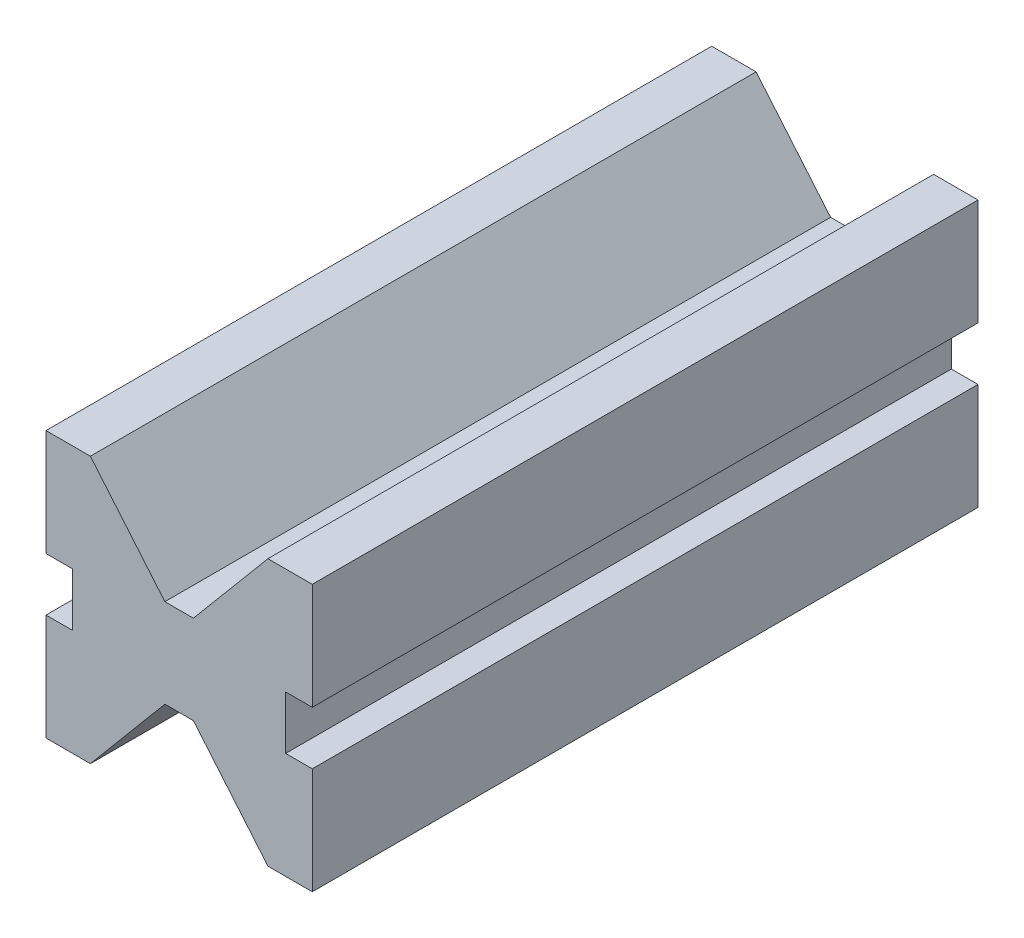
ISO-10303-21;
HEADER;
FILE_DESCRIPTION(('STEP AP214'),'2;1');
FILE_NAME('part.step','',(''),(''),'','','');
FILE_SCHEMA(('AUTOMOTIVE_DESIGN { 1 0 10303 214 1 1 1 1 }'));
ENDSEC;
DATA;
#1=APPLICATION_CONTEXT('core data for automotive mechanical design processes');
#2=APPLICATION_PROTOCOL_DEFINITION('international standard','automotive_design',2000,#1);
#3=PRODUCT_CONTEXT('',#1,'mechanical');
#4=PRODUCT('Part','Part','',(#3));
#5=PRODUCT_RELATED_PRODUCT_CATEGORY('part','',(#4));
#6=PRODUCT_DEFINITION_FORMATION('','',#4);
#7=PRODUCT_DEFINITION_CONTEXT('part definition',#1,'design');
#8=PRODUCT_DEFINITION('design','',#6,#7);
#9=PRODUCT_DEFINITION_SHAPE('','',#8);
#10=(LENGTH_UNIT() NAMED_UNIT(*) SI_UNIT(.MILLI.,.METRE.));
#11=(NAMED_UNIT(*) PLANE_ANGLE_UNIT() SI_UNIT($,.RADIAN.));
#12=(NAMED_UNIT(*) SI_UNIT($,.STERADIAN.) SOLID_ANGLE_UNIT());
#13=UNCERTAINTY_MEASURE_WITH_UNIT(LENGTH_MEASURE(1.E-05),#10,'distance_accuracy_value','');
#14=(GEOMETRIC_REPRESENTATION_CONTEXT(3) GLOBAL_UNCERTAINTY_ASSIGNED_CONTEXT((#13)) GLOBAL_UNIT_ASSIGNED_CONTEXT((#10,
#11,#12)) REPRESENTATION_CONTEXT('',''));
#15=CARTESIAN_POINT('',(0.,0.,0.));
#16=DIRECTION('',(0.,0.,1.));
#17=DIRECTION('',(1.,0.,0.));
#18=AXIS2_PLACEMENT_3D('',#15,#16,#17);
#19=CARTESIAN_POINT('',(10.,0.,150.));
#20=DIRECTION('',(0.,1.,0.));
#21=DIRECTION('',(0.,0.,1.));
#22=AXIS2_PLACEMENT_3D('',#19,#20,#21);
#23=PLANE('',#22);
#24=DIRECTION('',(1.,0.,0.));
#25=VECTOR('',#24,1.);
#26=CARTESIAN_POINT('',(10.,0.,0.));
#27=LINE('',#26,#25);
#28=CARTESIAN_POINT('',(0.,0.,0.));
#29=VERTEX_POINT('',#28);
#30=CARTESIAN_POINT('',(10.,0.,0.));
#31=VERTEX_POINT('',#30);
#32=EDGE_CURVE('E212',#29,#31,#27,.T.);
#33=ORIENTED_EDGE('',*,*,#32,.T.);
#34=DIRECTION('',(0.,0.,-1.));
#35=VECTOR('',#34,1.);
#36=CARTESIAN_POINT('',(10.,0.,150.));
#37=LINE('',#36,#35);
#38=CARTESIAN_POINT('',(10.,0.,150.));
#39=VERTEX_POINT('',#38);
#40=EDGE_CURVE('E11',#39,#31,#37,.T.);
#41=ORIENTED_EDGE('',*,*,#40,.F.);
#42=DIRECTION('',(1.,0.,0.));
#43=VECTOR('',#42,1.);
#44=CARTESIAN_POINT('',(10.,0.,150.));
#45=LINE('',#44,#43);
#46=CARTESIAN_POINT('',(0.,0.,150.));
#47=VERTEX_POINT('',#46);
#48=EDGE_CURVE('E270',#47,#39,#45,.T.);
#49=ORIENTED_EDGE('',*,*,#48,.F.);
#50=DIRECTION('',(0.,0.,-1.));
#51=VECTOR('',#50,1.);
#52=CARTESIAN_POINT('',(0.,0.,150.));
#53=LINE('',#52,#51);
#54=EDGE_CURVE('E208',#47,#29,#53,.T.);
#55=ORIENTED_EDGE('',*,*,#54,.T.);
#56=EDGE_LOOP('',(#33,#41,#49,#55));
#57=FACE_BOUND('',#56,.T.);
#58=ADVANCED_FACE('F39',(#57),#23,.F.);
#59=CARTESIAN_POINT('',(26.7819926235455,20.,150.));
#60=DIRECTION('',(-0.766044443118979,0.642787609686538,0.));
#61=DIRECTION('',(-0.642787609686538,-0.766044443118979,0.));
#62=AXIS2_PLACEMENT_3D('',#59,#60,#61);
#63=PLANE('',#62);
#64=DIRECTION('',(0.642787609686538,0.766044443118979,0.));
#65=VECTOR('',#64,1.);
#66=CARTESIAN_POINT('',(26.7819926235455,20.,0.));
#67=LINE('',#66,#65);
#68=CARTESIAN_POINT('',(26.7819926235455,20.,0.));
#69=VERTEX_POINT('',#68);
#70=EDGE_CURVE('E216',#31,#69,#67,.T.);
#71=ORIENTED_EDGE('',*,*,#70,.T.);
#72=DIRECTION('',(0.,0.,-1.));
#73=VECTOR('',#72,1.);
#74=CARTESIAN_POINT('',(26.7819926235455,20.,150.));
#75=LINE('',#74,#73);
#76=CARTESIAN_POINT('',(26.7819926235455,20.,150.));
#77=VERTEX_POINT('',#76);
#78=EDGE_CURVE('E48',#77,#69,#75,.T.);
#79=ORIENTED_EDGE('',*,*,#78,.F.);
#80=DIRECTION('',(0.642787609686538,0.766044443118979,0.));
#81=VECTOR('',#80,1.);
#82=CARTESIAN_POINT('',(26.7819926235455,20.,150.));
#83=LINE('',#82,#81);
#84=EDGE_CURVE('E135',#39,#77,#83,.T.);
#85=ORIENTED_EDGE('',*,*,#84,.F.);
#86=ORIENTED_EDGE('',*,*,#40,.T.);
#87=EDGE_LOOP('',(#71,#79,#85,#86));
#88=FACE_BOUND('',#87,.T.);
#89=ADVANCED_FACE('F420',(#88),#63,.F.);
#90=CARTESIAN_POINT('',(33.2180073764545,20.,150.));
#91=DIRECTION('',(0.,1.,0.));
#92=DIRECTION('',(0.,0.,1.));
#93=AXIS2_PLACEMENT_3D('',#90,#91,#92);
#94=PLANE('',#93);
#95=DIRECTION('',(1.,0.,0.));
#96=VECTOR('',#95,1.);
#97=CARTESIAN_POINT('',(33.2180073764545,20.,0.));
#98=LINE('',#97,#96);
#99=CARTESIAN_POINT('',(33.2180073764545,20.,0.));
#100=VERTEX_POINT('',#99);
#101=EDGE_CURVE('E219',#69,#100,#98,.T.);
#102=ORIENTED_EDGE('',*,*,#101,.T.);
#103=DIRECTION('',(0.,0.,-1.));
#104=VECTOR('',#103,1.);
#105=CARTESIAN_POINT('',(33.2180073764545,20.,150.));
#106=LINE('',#105,#104);
#107=CARTESIAN_POINT('',(33.2180073764545,20.,150.));
#108=VERTEX_POINT('',#107);
#109=EDGE_CURVE('E329',#108,#100,#106,.T.);
#110=ORIENTED_EDGE('',*,*,#109,.F.);
#111=DIRECTION('',(1.,0.,0.));
#112=VECTOR('',#111,1.);
#113=CARTESIAN_POINT('',(33.2180073764545,20.,150.));
#114=LINE('',#113,#112);
#115=EDGE_CURVE('E339',#77,#108,#114,.T.);
#116=ORIENTED_EDGE('',*,*,#115,.F.);
#117=ORIENTED_EDGE('',*,*,#78,.T.);
#118=EDGE_LOOP('',(#102,#110,#116,#117));
#119=FACE_BOUND('',#118,.T.);
#120=ADVANCED_FACE('F337',(#119),#94,.F.);
#121=CARTESIAN_POINT('',(50.,0.,150.));
#122=DIRECTION('',(0.766044443118979,0.642787609686538,0.));
#123=DIRECTION('',(-0.642787609686538,0.766044443118979,0.));
#124=AXIS2_PLACEMENT_3D('',#121,#122,#123);
#125=PLANE('',#124);
#126=DIRECTION('',(0.642787609686538,-0.766044443118979,0.));
#127=VECTOR('',#126,1.);
#128=CARTESIAN_POINT('',(50.,0.,0.));
#129=LINE('',#128,#127);
#130=CARTESIAN_POINT('',(50.,0.,0.));
#131=VERTEX_POINT('',#130);
#132=EDGE_CURVE('E222',#100,#131,#129,.T.);
#133=ORIENTED_EDGE('',*,*,#132,.T.);
#134=DIRECTION('',(0.,0.,-1.));
#135=VECTOR('',#134,1.);
#136=CARTESIAN_POINT('',(50.,0.,150.));
#137=LINE('',#136,#135);
#138=CARTESIAN_POINT('',(50.,0.,150.));
#139=VERTEX_POINT('',#138);
#140=EDGE_CURVE('E325',#139,#131,#137,.T.);
#141=ORIENTED_EDGE('',*,*,#140,.F.);
#142=DIRECTION('',(0.642787609686538,-0.766044443118979,0.));
#143=VECTOR('',#142,1.);
#144=CARTESIAN_POINT('',(50.,0.,150.));
#145=LINE('',#144,#143);
#146=EDGE_CURVE('E358',#108,#139,#145,.T.);
#147=ORIENTED_EDGE('',*,*,#146,.F.);
#148=ORIENTED_EDGE('',*,*,#109,.T.);
#149=EDGE_LOOP('',(#133,#141,#147,#148));
#150=FACE_BOUND('',#149,.T.);
#151=ADVANCED_FACE('F348',(#150),#125,.F.);
#152=CARTESIAN_POINT('',(60.,0.,150.));
#153=DIRECTION('',(0.,1.,0.));
#154=DIRECTION('',(0.,0.,1.));
#155=AXIS2_PLACEMENT_3D('',#152,#153,#154);
#156=PLANE('',#155);
#157=DIRECTION('',(1.,0.,0.));
#158=VECTOR('',#157,1.);
#159=CARTESIAN_POINT('',(60.,0.,0.));
#160=LINE('',#159,#158);
#161=CARTESIAN_POINT('',(60.,0.,0.));
#162=VERTEX_POINT('',#161);
#163=EDGE_CURVE('E225',#131,#162,#160,.T.);
#164=ORIENTED_EDGE('',*,*,#163,.T.);
#165=DIRECTION('',(0.,0.,-1.));
#166=VECTOR('',#165,1.);
#167=CARTESIAN_POINT('',(60.,0.,150.));
#168=LINE('',#167,#166);
#169=CARTESIAN_POINT('',(60.,0.,150.));
#170=VERTEX_POINT('',#169);
#171=EDGE_CURVE('E321',#170,#162,#168,.T.);
#172=ORIENTED_EDGE('',*,*,#171,.F.);
#173=DIRECTION('',(1.,0.,0.));
#174=VECTOR('',#173,1.);
#175=CARTESIAN_POINT('',(60.,0.,150.));
#176=LINE('',#175,#174);
#177=EDGE_CURVE('E354',#139,#170,#176,.T.);
#178=ORIENTED_EDGE('',*,*,#177,.F.);
#179=ORIENTED_EDGE('',*,*,#140,.T.);
#180=EDGE_LOOP('',(#164,#172,#178,#179));
#181=FACE_BOUND('',#180,.T.);
#182=ADVANCED_FACE('F352',(#181),#156,.F.);
#183=CARTESIAN_POINT('',(60.,24.,150.));
#184=DIRECTION('',(-1.,0.,0.));
#185=DIRECTION('',(0.,0.,1.));
#186=AXIS2_PLACEMENT_3D('',#183,#184,#185);
#187=PLANE('',#186);
#188=DIRECTION('',(0.,1.,0.));
#189=VECTOR('',#188,1.);
#190=CARTESIAN_POINT('',(60.,24.,0.));
#191=LINE('',#190,#189);
#192=CARTESIAN_POINT('',(60.,24.,0.));
#193=VERTEX_POINT('',#192);
#194=EDGE_CURVE('E228',#162,#193,#191,.T.);
#195=ORIENTED_EDGE('',*,*,#194,.T.);
#196=DIRECTION('',(0.,0.,-1.));
#197=VECTOR('',#196,1.);
#198=CARTESIAN_POINT('',(60.,24.,150.));
#199=LINE('',#198,#197);
#200=CARTESIAN_POINT('',(60.,24.,150.));
#201=VERTEX_POINT('',#200);
#202=EDGE_CURVE('E317',#201,#193,#199,.T.);
#203=ORIENTED_EDGE('',*,*,#202,.F.);
#204=DIRECTION('',(0.,1.,0.));
#205=VECTOR('',#204,1.);
#206=CARTESIAN_POINT('',(60.,24.,150.));
#207=LINE('',#206,#205);
#208=EDGE_CURVE('E357',#170,#201,#207,.T.);
#209=ORIENTED_EDGE('',*,*,#208,.F.);
#210=ORIENTED_EDGE('',*,*,#171,.T.);
#211=EDGE_LOOP('',(#195,#203,#209,#210));
#212=FACE_BOUND('',#211,.T.);
#213=ADVANCED_FACE('F433',(#212),#187,.F.);
#214=CARTESIAN_POINT('',(54.,24.,150.));
#215=DIRECTION('',(0.,-1.,0.));
#216=DIRECTION('',(0.,0.,-1.));
#217=AXIS2_PLACEMENT_3D('',#214,#215,#216);
#218=PLANE('',#217);
#219=DIRECTION('',(-1.,0.,0.));
#220=VECTOR('',#219,1.);
#221=CARTESIAN_POINT('',(54.,24.,0.));
#222=LINE('',#221,#220);
#223=CARTESIAN_POINT('',(54.,24.,0.));
#224=VERTEX_POINT('',#223);
#225=EDGE_CURVE('E231',#193,#224,#222,.T.);
#226=ORIENTED_EDGE('',*,*,#225,.T.);
#227=DIRECTION('',(0.,0.,-1.));
#228=VECTOR('',#227,1.);
#229=CARTESIAN_POINT('',(54.,24.,150.));
#230=LINE('',#229,#228);
#231=CARTESIAN_POINT('',(54.,24.,150.));
#232=VERTEX_POINT('',#231);
#233=EDGE_CURVE('E313',#232,#224,#230,.T.);
#234=ORIENTED_EDGE('',*,*,#233,.F.);
#235=DIRECTION('',(-1.,0.,0.));
#236=VECTOR('',#235,1.);
#237=CARTESIAN_POINT('',(54.,24.,150.));
#238=LINE('',#237,#236);
#239=EDGE_CURVE('E362',#201,#232,#238,.T.);
#240=ORIENTED_EDGE('',*,*,#239,.F.);
#241=ORIENTED_EDGE('',*,*,#202,.T.);
#242=EDGE_LOOP('',(#226,#234,#240,#241));
#243=FACE_BOUND('',#242,.T.);
#244=ADVANCED_FACE('F436',(#243),#218,.F.);
#245=CARTESIAN_POINT('',(54.,36.,150.));
#246=DIRECTION('',(-1.,0.,0.));
#247=DIRECTION('',(0.,-1.,0.));
#248=AXIS2_PLACEMENT_3D('',#245,#246,#247);
#249=PLANE('',#248);
#250=DIRECTION('',(0.,1.,0.));
#251=VECTOR('',#250,1.);
#252=CARTESIAN_POINT('',(54.,36.,0.));
#253=LINE('',#252,#251);
#254=CARTESIAN_POINT('',(54.,36.,0.));
#255=VERTEX_POINT('',#254);
#256=EDGE_CURVE('E234',#224,#255,#253,.T.);
#257=ORIENTED_EDGE('',*,*,#256,.T.);
#258=DIRECTION('',(0.,0.,-1.));
#259=VECTOR('',#258,1.);
#260=CARTESIAN_POINT('',(54.,36.,150.));
#261=LINE('',#260,#259);
#262=CARTESIAN_POINT('',(54.,36.,150.));
#263=VERTEX_POINT('',#262);
#264=EDGE_CURVE('E309',#263,#255,#261,.T.);
#265=ORIENTED_EDGE('',*,*,#264,.F.);
#266=DIRECTION('',(0.,1.,0.));
#267=VECTOR('',#266,1.);
#268=CARTESIAN_POINT('',(54.,36.,150.));
#269=LINE('',#268,#267);
#270=EDGE_CURVE('E369',#232,#263,#269,.T.);
#271=ORIENTED_EDGE('',*,*,#270,.F.);
#272=ORIENTED_EDGE('',*,*,#233,.T.);
#273=EDGE_LOOP('',(#257,#265,#271,#272));
#274=FACE_BOUND('',#273,.T.);
#275=ADVANCED_FACE('F440',(#274),#249,.F.);
#276=CARTESIAN_POINT('',(60.,36.,150.));
#277=DIRECTION('',(0.,1.,0.));
#278=DIRECTION('',(0.,0.,1.));
#279=AXIS2_PLACEMENT_3D('',#276,#277,#278);
#280=PLANE('',#279);
#281=DIRECTION('',(1.,0.,0.));
#282=VECTOR('',#281,1.);
#283=CARTESIAN_POINT('',(60.,36.,0.));
#284=LINE('',#283,#282);
#285=CARTESIAN_POINT('',(60.,36.,0.));
#286=VERTEX_POINT('',#285);
#287=EDGE_CURVE('E237',#255,#286,#284,.T.);
#288=ORIENTED_EDGE('',*,*,#287,.T.);
#289=DIRECTION('',(0.,0.,-1.));
#290=VECTOR('',#289,1.);
#291=CARTESIAN_POINT('',(60.,36.,150.));
#292=LINE('',#291,#290);
#293=CARTESIAN_POINT('',(60.,36.,150.));
#294=VERTEX_POINT('',#293);
#295=EDGE_CURVE('E305',#294,#286,#292,.T.);
#296=ORIENTED_EDGE('',*,*,#295,.F.);
#297=DIRECTION('',(1.,0.,0.));
#298=VECTOR('',#297,1.);
#299=CARTESIAN_POINT('',(60.,36.,150.));
#300=LINE('',#299,#298);
#301=EDGE_CURVE('E372',#263,#294,#300,.T.);
#302=ORIENTED_EDGE('',*,*,#301,.F.);
#303=ORIENTED_EDGE('',*,*,#264,.T.);
#304=EDGE_LOOP('',(#288,#296,#302,#303));
#305=FACE_BOUND('',#304,.T.);
#306=ADVANCED_FACE('F444',(#305),#280,.F.);
#307=CARTESIAN_POINT('',(60.,60.,150.));
#308=DIRECTION('',(-1.,0.,0.));
#309=DIRECTION('',(0.,-1.,0.));
#310=AXIS2_PLACEMENT_3D('',#307,#308,#309);
#311=PLANE('',#310);
#312=DIRECTION('',(0.,1.,0.));
#313=VECTOR('',#312,1.);
#314=CARTESIAN_POINT('',(60.,60.,0.));
#315=LINE('',#314,#313);
#316=CARTESIAN_POINT('',(60.,60.,0.));
#317=VERTEX_POINT('',#316);
#318=EDGE_CURVE('E240',#286,#317,#315,.T.);
#319=ORIENTED_EDGE('',*,*,#318,.T.);
#320=DIRECTION('',(0.,0.,-1.));
#321=VECTOR('',#320,1.);
#322=CARTESIAN_POINT('',(60.,60.,150.));
#323=LINE('',#322,#321);
#324=CARTESIAN_POINT('',(60.,60.,150.));
#325=VERTEX_POINT('',#324);
#326=EDGE_CURVE('E301',#325,#317,#323,.T.);
#327=ORIENTED_EDGE('',*,*,#326,.F.);
#328=DIRECTION('',(0.,1.,0.));
#329=VECTOR('',#328,1.);
#330=CARTESIAN_POINT('',(60.,60.,150.));
#331=LINE('',#330,#329);
#332=EDGE_CURVE('E375',#294,#325,#331,.T.);
#333=ORIENTED_EDGE('',*,*,#332,.F.);
#334=ORIENTED_EDGE('',*,*,#295,.T.);
#335=EDGE_LOOP('',(#319,#327,#333,#334));
#336=FACE_BOUND('',#335,.T.);
#337=ADVANCED_FACE('F448',(#336),#311,.F.);
#338=CARTESIAN_POINT('',(50.,60.,150.));
#339=DIRECTION('',(0.,-1.,0.));
#340=DIRECTION('',(0.,0.,-1.));
#341=AXIS2_PLACEMENT_3D('',#338,#339,#340);
#342=PLANE('',#341);
#343=DIRECTION('',(-1.,0.,0.));
#344=VECTOR('',#343,1.);
#345=CARTESIAN_POINT('',(50.,60.,0.));
#346=LINE('',#345,#344);
#347=CARTESIAN_POINT('',(50.,60.,0.));
#348=VERTEX_POINT('',#347);
#349=EDGE_CURVE('E243',#317,#348,#346,.T.);
#350=ORIENTED_EDGE('',*,*,#349,.T.);
#351=DIRECTION('',(0.,0.,-1.));
#352=VECTOR('',#351,1.);
#353=CARTESIAN_POINT('',(50.,60.,150.));
#354=LINE('',#353,#352);
#355=CARTESIAN_POINT('',(50.,60.,150.));
#356=VERTEX_POINT('',#355);
#357=EDGE_CURVE('E297',#356,#348,#354,.T.);
#358=ORIENTED_EDGE('',*,*,#357,.F.);
#359=DIRECTION('',(-1.,0.,0.));
#360=VECTOR('',#359,1.);
#361=CARTESIAN_POINT('',(50.,60.,150.));
#362=LINE('',#361,#360);
#363=EDGE_CURVE('E378',#325,#356,#362,.T.);
#364=ORIENTED_EDGE('',*,*,#363,.F.);
#365=ORIENTED_EDGE('',*,*,#326,.T.);
#366=EDGE_LOOP('',(#350,#358,#364,#365));
#367=FACE_BOUND('',#366,.T.);
#368=ADVANCED_FACE('F452',(#367),#342,.F.);
#369=CARTESIAN_POINT('',(33.2180073764545,40.,150.));
#370=DIRECTION('',(0.766044443118979,-0.642787609686538,0.));
#371=DIRECTION('',(0.642787609686538,0.766044443118979,0.));
#372=AXIS2_PLACEMENT_3D('',#369,#370,#371);
#373=PLANE('',#372);
#374=DIRECTION('',(-0.642787609686538,-0.766044443118979,0.));
#375=VECTOR('',#374,1.);
#376=CARTESIAN_POINT('',(33.2180073764545,40.,0.));
#377=LINE('',#376,#375);
#378=CARTESIAN_POINT('',(33.2180073764545,40.,0.));
#379=VERTEX_POINT('',#378);
#380=EDGE_CURVE('E246',#348,#379,#377,.T.);
#381=ORIENTED_EDGE('',*,*,#380,.T.);
#382=DIRECTION('',(0.,0.,-1.));
#383=VECTOR('',#382,1.);
#384=CARTESIAN_POINT('',(33.2180073764545,40.,150.));
#385=LINE('',#384,#383);
#386=CARTESIAN_POINT('',(33.2180073764545,40.,150.));
#387=VERTEX_POINT('',#386);
#388=EDGE_CURVE('E293',#387,#379,#385,.T.);
#389=ORIENTED_EDGE('',*,*,#388,.F.);
#390=DIRECTION('',(-0.642787609686538,-0.766044443118979,0.));
#391=VECTOR('',#390,1.);
#392=CARTESIAN_POINT('',(33.2180073764545,40.,150.));
#393=LINE('',#392,#391);
#394=EDGE_CURVE('E381',#356,#387,#393,.T.);
#395=ORIENTED_EDGE('',*,*,#394,.F.);
#396=ORIENTED_EDGE('',*,*,#357,.T.);
#397=EDGE_LOOP('',(#381,#389,#395,#396));
#398=FACE_BOUND('',#397,.T.);
#399=ADVANCED_FACE('F456',(#398),#373,.F.);
#400=CARTESIAN_POINT('',(26.7819926235455,40.,150.));
#401=DIRECTION('',(0.,-1.,0.));
#402=DIRECTION('',(0.,0.,-1.));
#403=AXIS2_PLACEMENT_3D('',#400,#401,#402);
#404=PLANE('',#403);
#405=DIRECTION('',(-1.,0.,0.));
#406=VECTOR('',#405,1.);
#407=CARTESIAN_POINT('',(26.7819926235455,40.,0.));
#408=LINE('',#407,#406);
#409=CARTESIAN_POINT('',(26.7819926235455,40.,0.));
#410=VERTEX_POINT('',#409);
#411=EDGE_CURVE('E249',#379,#410,#408,.T.);
#412=ORIENTED_EDGE('',*,*,#411,.T.);
#413=DIRECTION('',(0.,0.,-1.));
#414=VECTOR('',#413,1.);
#415=CARTESIAN_POINT('',(26.7819926235455,40.,150.));
#416=LINE('',#415,#414);
#417=CARTESIAN_POINT('',(26.7819926235455,40.,150.));
#418=VERTEX_POINT('',#417);
#419=EDGE_CURVE('E289',#418,#410,#416,.T.);
#420=ORIENTED_EDGE('',*,*,#419,.F.);
#421=DIRECTION('',(-1.,0.,0.));
#422=VECTOR('',#421,1.);
#423=CARTESIAN_POINT('',(26.7819926235455,40.,150.));
#424=LINE('',#423,#422);
#425=EDGE_CURVE('E384',#387,#418,#424,.T.);
#426=ORIENTED_EDGE('',*,*,#425,.F.);
#427=ORIENTED_EDGE('',*,*,#388,.T.);
#428=EDGE_LOOP('',(#412,#420,#426,#427));
#429=FACE_BOUND('',#428,.T.);
#430=ADVANCED_FACE('F460',(#429),#404,.F.);
#431=CARTESIAN_POINT('',(10.,60.,150.));
#432=DIRECTION('',(-0.766044443118979,-0.642787609686538,0.));
#433=DIRECTION('',(0.642787609686538,-0.766044443118979,0.));
#434=AXIS2_PLACEMENT_3D('',#431,#432,#433);
#435=PLANE('',#434);
#436=DIRECTION('',(-0.642787609686538,0.766044443118979,0.));
#437=VECTOR('',#436,1.);
#438=CARTESIAN_POINT('',(10.,60.,0.));
#439=LINE('',#438,#437);
#440=CARTESIAN_POINT('',(10.,60.,0.));
#441=VERTEX_POINT('',#440);
#442=EDGE_CURVE('E252',#410,#441,#439,.T.);
#443=ORIENTED_EDGE('',*,*,#442,.T.);
#444=DIRECTION('',(0.,0.,-1.));
#445=VECTOR('',#444,1.);
#446=CARTESIAN_POINT('',(10.,60.,150.));
#447=LINE('',#446,#445);
#448=CARTESIAN_POINT('',(10.,60.,150.));
#449=VERTEX_POINT('',#448);
#450=EDGE_CURVE('E285',#449,#441,#447,.T.);
#451=ORIENTED_EDGE('',*,*,#450,.F.);
#452=DIRECTION('',(-0.642787609686538,0.766044443118979,0.));
#453=VECTOR('',#452,1.);
#454=CARTESIAN_POINT('',(10.,60.,150.));
#455=LINE('',#454,#453);
#456=EDGE_CURVE('E387',#418,#449,#455,.T.);
#457=ORIENTED_EDGE('',*,*,#456,.F.);
#458=ORIENTED_EDGE('',*,*,#419,.T.);
#459=EDGE_LOOP('',(#443,#451,#457,#458));
#460=FACE_BOUND('',#459,.T.);
#461=ADVANCED_FACE('F464',(#460),#435,.F.);
#462=CARTESIAN_POINT('',(0.,60.,150.));
#463=DIRECTION('',(0.,-1.,0.));
#464=DIRECTION('',(0.,0.,-1.));
#465=AXIS2_PLACEMENT_3D('',#462,#463,#464);
#466=PLANE('',#465);
#467=DIRECTION('',(-1.,0.,0.));
#468=VECTOR('',#467,1.);
#469=CARTESIAN_POINT('',(0.,60.,0.));
#470=LINE('',#469,#468);
#471=CARTESIAN_POINT('',(0.,60.,0.));
#472=VERTEX_POINT('',#471);
#473=EDGE_CURVE('E255',#441,#472,#470,.T.);
#474=ORIENTED_EDGE('',*,*,#473,.T.);
#475=DIRECTION('',(0.,0.,-1.));
#476=VECTOR('',#475,1.);
#477=CARTESIAN_POINT('',(0.,60.,150.));
#478=LINE('',#477,#476);
#479=CARTESIAN_POINT('',(0.,60.,150.));
#480=VERTEX_POINT('',#479);
#481=EDGE_CURVE('E281',#480,#472,#478,.T.);
#482=ORIENTED_EDGE('',*,*,#481,.F.);
#483=DIRECTION('',(-1.,0.,0.));
#484=VECTOR('',#483,1.);
#485=CARTESIAN_POINT('',(0.,60.,150.));
#486=LINE('',#485,#484);
#487=EDGE_CURVE('E390',#449,#480,#486,.T.);
#488=ORIENTED_EDGE('',*,*,#487,.F.);
#489=ORIENTED_EDGE('',*,*,#450,.T.);
#490=EDGE_LOOP('',(#474,#482,#488,#489));
#491=FACE_BOUND('',#490,.T.);
#492=ADVANCED_FACE('F468',(#491),#466,.F.);
#493=CARTESIAN_POINT('',(0.,36.,150.));
#494=DIRECTION('',(1.,0.,0.));
#495=DIRECTION('',(0.,0.,-1.));
#496=AXIS2_PLACEMENT_3D('',#493,#494,#495);
#497=PLANE('',#496);
#498=DIRECTION('',(0.,-1.,0.));
#499=VECTOR('',#498,1.);
#500=CARTESIAN_POINT('',(0.,36.,0.));
#501=LINE('',#500,#499);
#502=CARTESIAN_POINT('',(0.,36.,0.));
#503=VERTEX_POINT('',#502);
#504=EDGE_CURVE('E258',#472,#503,#501,.T.);
#505=ORIENTED_EDGE('',*,*,#504,.T.);
#506=DIRECTION('',(0.,0.,-1.));
#507=VECTOR('',#506,1.);
#508=CARTESIAN_POINT('',(0.,36.,150.));
#509=LINE('',#508,#507);
#510=CARTESIAN_POINT('',(0.,36.,150.));
#511=VERTEX_POINT('',#510);
#512=EDGE_CURVE('E277',#511,#503,#509,.T.);
#513=ORIENTED_EDGE('',*,*,#512,.F.);
#514=DIRECTION('',(0.,-1.,0.));
#515=VECTOR('',#514,1.);
#516=CARTESIAN_POINT('',(0.,36.,150.));
#517=LINE('',#516,#515);
#518=EDGE_CURVE('E393',#480,#511,#517,.T.);
#519=ORIENTED_EDGE('',*,*,#518,.F.);
#520=ORIENTED_EDGE('',*,*,#481,.T.);
#521=EDGE_LOOP('',(#505,#513,#519,#520));
#522=FACE_BOUND('',#521,.T.);
#523=ADVANCED_FACE('F401',(#522),#497,.F.);
#524=CARTESIAN_POINT('',(6.,36.,150.));
#525=DIRECTION('',(0.,1.,0.));
#526=DIRECTION('',(-1.,0.,0.));
#527=AXIS2_PLACEMENT_3D('',#524,#525,#526);
#528=PLANE('',#527);
#529=DIRECTION('',(1.,0.,0.));
#530=VECTOR('',#529,1.);
#531=CARTESIAN_POINT('',(6.,36.,0.));
#532=LINE('',#531,#530);
#533=CARTESIAN_POINT('',(6.,36.,0.));
#534=VERTEX_POINT('',#533);
#535=EDGE_CURVE('E261',#503,#534,#532,.T.);
#536=ORIENTED_EDGE('',*,*,#535,.T.);
#537=DIRECTION('',(0.,0.,-1.));
#538=VECTOR('',#537,1.);
#539=CARTESIAN_POINT('',(6.,36.,150.));
#540=LINE('',#539,#538);
#541=CARTESIAN_POINT('',(6.,36.,150.));
#542=VERTEX_POINT('',#541);
#543=EDGE_CURVE('E201',#542,#534,#540,.T.);
#544=ORIENTED_EDGE('',*,*,#543,.F.);
#545=DIRECTION('',(1.,0.,0.));
#546=VECTOR('',#545,1.);
#547=CARTESIAN_POINT('',(6.,36.,150.));
#548=LINE('',#547,#546);
#549=EDGE_CURVE('E190',#511,#542,#548,.T.);
#550=ORIENTED_EDGE('',*,*,#549,.F.);
#551=ORIENTED_EDGE('',*,*,#512,.T.);
#552=EDGE_LOOP('',(#536,#544,#550,#551));
#553=FACE_BOUND('',#552,.T.);
#554=ADVANCED_FACE('F405',(#553),#528,.F.);
#555=CARTESIAN_POINT('',(6.,24.,150.));
#556=DIRECTION('',(1.,0.,0.));
#557=DIRECTION('',(0.,1.,0.));
#558=AXIS2_PLACEMENT_3D('',#555,#556,#557);
#559=PLANE('',#558);
#560=DIRECTION('',(0.,-1.,0.));
#561=VECTOR('',#560,1.);
#562=CARTESIAN_POINT('',(6.,24.,0.));
#563=LINE('',#562,#561);
#564=CARTESIAN_POINT('',(6.,24.,0.));
#565=VERTEX_POINT('',#564);
#566=EDGE_CURVE('E199',#534,#565,#563,.T.);
#567=ORIENTED_EDGE('',*,*,#566,.T.);
#568=DIRECTION('',(0.,0.,-1.));
#569=VECTOR('',#568,1.);
#570=CARTESIAN_POINT('',(6.,24.,150.));
#571=LINE('',#570,#569);
#572=CARTESIAN_POINT('',(6.,24.,150.));
#573=VERTEX_POINT('',#572);
#574=EDGE_CURVE('E196',#573,#565,#571,.T.);
#575=ORIENTED_EDGE('',*,*,#574,.F.);
#576=DIRECTION('',(0.,-1.,0.));
#577=VECTOR('',#576,1.);
#578=CARTESIAN_POINT('',(6.,24.,150.));
#579=LINE('',#578,#577);
#580=EDGE_CURVE('E184',#542,#573,#579,.T.);
#581=ORIENTED_EDGE('',*,*,#580,.F.);
#582=ORIENTED_EDGE('',*,*,#543,.T.);
#583=EDGE_LOOP('',(#567,#575,#581,#582));
#584=FACE_BOUND('',#583,.T.);
#585=ADVANCED_FACE('F197',(#584),#559,.F.);
#586=CARTESIAN_POINT('',(0.,24.,150.));
#587=DIRECTION('',(0.,-1.,0.));
#588=DIRECTION('',(0.,0.,-1.));
#589=AXIS2_PLACEMENT_3D('',#586,#587,#588);
#590=PLANE('',#589);
#591=DIRECTION('',(-1.,0.,0.));
#592=VECTOR('',#591,1.);
#593=CARTESIAN_POINT('',(0.,24.,0.));
#594=LINE('',#593,#592);
#595=CARTESIAN_POINT('',(0.,24.,0.));
#596=VERTEX_POINT('',#595);
#597=EDGE_CURVE('E121',#565,#596,#594,.T.);
#598=ORIENTED_EDGE('',*,*,#597,.T.);
#599=DIRECTION('',(0.,0.,-1.));
#600=VECTOR('',#599,1.);
#601=CARTESIAN_POINT('',(0.,24.,150.));
#602=LINE('',#601,#600);
#603=CARTESIAN_POINT('',(0.,24.,150.));
#604=VERTEX_POINT('',#603);
#605=EDGE_CURVE('E202',#604,#596,#602,.T.);
#606=ORIENTED_EDGE('',*,*,#605,.F.);
#607=DIRECTION('',(-1.,0.,0.));
#608=VECTOR('',#607,1.);
#609=CARTESIAN_POINT('',(0.,24.,150.));
#610=LINE('',#609,#608);
#611=EDGE_CURVE('E188',#573,#604,#610,.T.);
#612=ORIENTED_EDGE('',*,*,#611,.F.);
#613=ORIENTED_EDGE('',*,*,#574,.T.);
#614=EDGE_LOOP('',(#598,#606,#612,#613));
#615=FACE_BOUND('',#614,.T.);
#616=ADVANCED_FACE('F204',(#615),#590,.F.);
#617=CARTESIAN_POINT('',(0.,0.,150.));
#618=DIRECTION('',(1.,0.,0.));
#619=DIRECTION('',(0.,0.,-1.));
#620=AXIS2_PLACEMENT_3D('',#617,#618,#619);
#621=PLANE('',#620);
#622=DIRECTION('',(0.,-1.,0.));
#623=VECTOR('',#622,1.);
#624=CARTESIAN_POINT('',(0.,0.,0.));
#625=LINE('',#624,#623);
#626=EDGE_CURVE('E127',#596,#29,#625,.T.);
#627=ORIENTED_EDGE('',*,*,#626,.T.);
#628=ORIENTED_EDGE('',*,*,#54,.F.);
#629=DIRECTION('',(0.,-1.,0.));
#630=VECTOR('',#629,1.);
#631=CARTESIAN_POINT('',(0.,0.,150.));
#632=LINE('',#631,#630);
#633=EDGE_CURVE('E56',#604,#47,#632,.T.);
#634=ORIENTED_EDGE('',*,*,#633,.F.);
#635=ORIENTED_EDGE('',*,*,#605,.T.);
#636=EDGE_LOOP('',(#627,#628,#634,#635));
#637=FACE_BOUND('',#636,.T.);
#638=ADVANCED_FACE('F409',(#637),#621,.F.);
#639=CARTESIAN_POINT('',(0.,0.,150.));
#640=DIRECTION('',(0.,0.,-1.));
#641=DIRECTION('',(-1.,0.,0.));
#642=AXIS2_PLACEMENT_3D('',#639,#640,#641);
#643=PLANE('',#642);
#644=ORIENTED_EDGE('',*,*,#48,.T.);
#645=ORIENTED_EDGE('',*,*,#84,.T.);
#646=ORIENTED_EDGE('',*,*,#115,.T.);
#647=ORIENTED_EDGE('',*,*,#146,.T.);
#648=ORIENTED_EDGE('',*,*,#177,.T.);
#649=ORIENTED_EDGE('',*,*,#208,.T.);
#650=ORIENTED_EDGE('',*,*,#239,.T.);
#651=ORIENTED_EDGE('',*,*,#270,.T.);
#652=ORIENTED_EDGE('',*,*,#301,.T.);
#653=ORIENTED_EDGE('',*,*,#332,.T.);
#654=ORIENTED_EDGE('',*,*,#363,.T.);
#655=ORIENTED_EDGE('',*,*,#394,.T.);
#656=ORIENTED_EDGE('',*,*,#425,.T.);
#657=ORIENTED_EDGE('',*,*,#456,.T.);
#658=ORIENTED_EDGE('',*,*,#487,.T.);
#659=ORIENTED_EDGE('',*,*,#518,.T.);
#660=ORIENTED_EDGE('',*,*,#549,.T.);
#661=ORIENTED_EDGE('',*,*,#580,.T.);
#662=ORIENTED_EDGE('',*,*,#611,.T.);
#663=ORIENTED_EDGE('',*,*,#633,.T.);
#664=EDGE_LOOP('',(#644,#645,#646,#647,#648,#649,#650,#651,#652,#653,#654,#655,#656,#657,#658,
#659,#660,#661,#662,#663));
#665=FACE_BOUND('',#664,.T.);
#666=ADVANCED_FACE('F186',(#665),#643,.F.);
#667=CARTESIAN_POINT('',(0.,0.,0.));
#668=DIRECTION('',(0.,0.,-1.));
#669=DIRECTION('',(-1.,0.,0.));
#670=AXIS2_PLACEMENT_3D('',#667,#668,#669);
#671=PLANE('',#670);
#672=ORIENTED_EDGE('',*,*,#32,.F.);
#673=ORIENTED_EDGE('',*,*,#626,.F.);
#674=ORIENTED_EDGE('',*,*,#597,.F.);
#675=ORIENTED_EDGE('',*,*,#566,.F.);
#676=ORIENTED_EDGE('',*,*,#535,.F.);
#677=ORIENTED_EDGE('',*,*,#504,.F.);
#678=ORIENTED_EDGE('',*,*,#473,.F.);
#679=ORIENTED_EDGE('',*,*,#442,.F.);
#680=ORIENTED_EDGE('',*,*,#411,.F.);
#681=ORIENTED_EDGE('',*,*,#380,.F.);
#682=ORIENTED_EDGE('',*,*,#349,.F.);
#683=ORIENTED_EDGE('',*,*,#318,.F.);
#684=ORIENTED_EDGE('',*,*,#287,.F.);
#685=ORIENTED_EDGE('',*,*,#256,.F.);
#686=ORIENTED_EDGE('',*,*,#225,.F.);
#687=ORIENTED_EDGE('',*,*,#194,.F.);
#688=ORIENTED_EDGE('',*,*,#163,.F.);
#689=ORIENTED_EDGE('',*,*,#132,.F.);
#690=ORIENTED_EDGE('',*,*,#101,.F.);
#691=ORIENTED_EDGE('',*,*,#70,.F.);
#692=EDGE_LOOP('',(#672,#673,#674,#675,#676,#677,#678,#679,#680,#681,#682,#683,#684,#685,#686,
#687,#688,#689,#690,#691));
#693=FACE_BOUND('',#692,.T.);
#694=ADVANCED_FACE('F343',(#693),#671,.T.);
#695=CLOSED_SHELL('',(#58,#89,#120,#151,#182,#213,#244,#275,#306,#337,#368,#399,#430,#461,#492,
#523,#554,#585,#616,#638,#666,#694));
#696=MANIFOLD_SOLID_BREP('B2',#695);
#697=ADVANCED_BREP_SHAPE_REPRESENTATION('',(#18,#696),#14);
#698=SHAPE_DEFINITION_REPRESENTATION(#9,#697);
ENDSEC;
END-ISO-10303-21;
